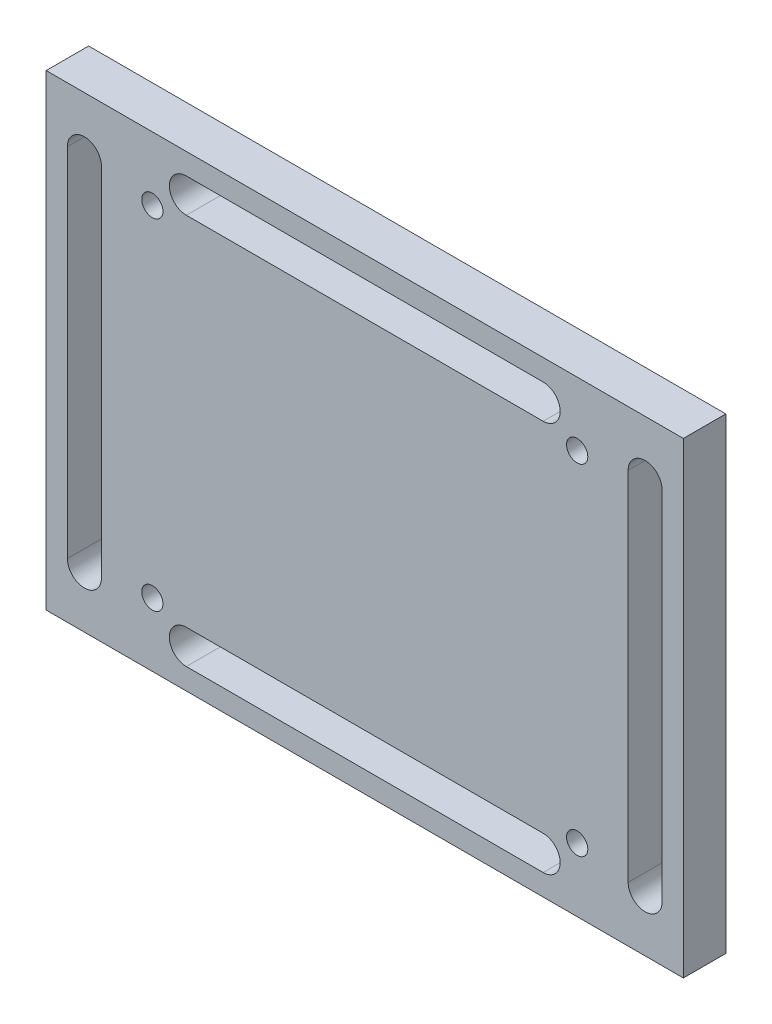
ISO-10303-21;
HEADER;
FILE_DESCRIPTION(('STEP AP214'),'2;1');
FILE_NAME('part.step','',(''),(''),'','','');
FILE_SCHEMA(('AUTOMOTIVE_DESIGN { 1 0 10303 214 1 1 1 1 }'));
ENDSEC;
DATA;
#1=APPLICATION_CONTEXT('core data for automotive mechanical design processes');
#2=APPLICATION_PROTOCOL_DEFINITION('international standard','automotive_design',2000,#1);
#3=PRODUCT_CONTEXT('',#1,'mechanical');
#4=PRODUCT('Part','Part','',(#3));
#5=PRODUCT_RELATED_PRODUCT_CATEGORY('part','',(#4));
#6=PRODUCT_DEFINITION_FORMATION('','',#4);
#7=PRODUCT_DEFINITION_CONTEXT('part definition',#1,'design');
#8=PRODUCT_DEFINITION('design','',#6,#7);
#9=PRODUCT_DEFINITION_SHAPE('','',#8);
#10=(LENGTH_UNIT() NAMED_UNIT(*) SI_UNIT(.MILLI.,.METRE.));
#11=(NAMED_UNIT(*) PLANE_ANGLE_UNIT() SI_UNIT($,.RADIAN.));
#12=(NAMED_UNIT(*) SI_UNIT($,.STERADIAN.) SOLID_ANGLE_UNIT());
#13=UNCERTAINTY_MEASURE_WITH_UNIT(LENGTH_MEASURE(1.E-05),#10,'distance_accuracy_value','');
#14=(GEOMETRIC_REPRESENTATION_CONTEXT(3) GLOBAL_UNCERTAINTY_ASSIGNED_CONTEXT((#13)) GLOBAL_UNIT_ASSIGNED_CONTEXT((#10,
#11,#12)) REPRESENTATION_CONTEXT('',''));
#15=CARTESIAN_POINT('',(0.,0.,0.));
#16=DIRECTION('',(0.,0.,1.));
#17=DIRECTION('',(1.,0.,0.));
#18=AXIS2_PLACEMENT_3D('',#15,#16,#17);
#19=CARTESIAN_POINT('',(0.,0.,5.));
#20=DIRECTION('',(0.,0.,1.));
#21=DIRECTION('',(1.,0.,0.));
#22=AXIS2_PLACEMENT_3D('',#19,#20,#21);
#23=PLANE('',#22);
#24=CARTESIAN_POINT('',(25.,-20.,5.));
#25=DIRECTION('',(0.,0.,1.));
#26=DIRECTION('',(1.,0.,0.));
#27=AXIS2_PLACEMENT_3D('',#24,#25,#26);
#28=CIRCLE('',#27,1.25);
#29=CARTESIAN_POINT('',(26.25,-20.,5.));
#30=VERTEX_POINT('',#29);
#31=EDGE_CURVE('E304',#30,#30,#28,.T.);
#32=ORIENTED_EDGE('',*,*,#31,.F.);
#33=EDGE_LOOP('',(#32));
#34=FACE_BOUND('',#33,.T.);
#35=CARTESIAN_POINT('',(-25.,20.,5.));
#36=DIRECTION('',(0.,0.,1.));
#37=DIRECTION('',(1.,0.,0.));
#38=AXIS2_PLACEMENT_3D('',#35,#36,#37);
#39=CIRCLE('',#38,1.25);
#40=CARTESIAN_POINT('',(-23.75,20.,5.));
#41=VERTEX_POINT('',#40);
#42=EDGE_CURVE('E316',#41,#41,#39,.T.);
#43=ORIENTED_EDGE('',*,*,#42,.F.);
#44=EDGE_LOOP('',(#43));
#45=FACE_BOUND('',#44,.T.);
#46=DIRECTION('',(-1.,0.,0.));
#47=VECTOR('',#46,1.);
#48=CARTESIAN_POINT('',(37.5,27.5,5.));
#49=LINE('',#48,#47);
#50=CARTESIAN_POINT('',(37.5,27.5,5.));
#51=VERTEX_POINT('',#50);
#52=CARTESIAN_POINT('',(-37.5,27.5,5.));
#53=VERTEX_POINT('',#52);
#54=EDGE_CURVE('E322',#51,#53,#49,.T.);
#55=ORIENTED_EDGE('',*,*,#54,.T.);
#56=DIRECTION('',(0.,-1.,0.));
#57=VECTOR('',#56,1.);
#58=CARTESIAN_POINT('',(-37.5,27.5,5.));
#59=LINE('',#58,#57);
#60=CARTESIAN_POINT('',(-37.5,-27.5,5.));
#61=VERTEX_POINT('',#60);
#62=EDGE_CURVE('E325',#53,#61,#59,.T.);
#63=ORIENTED_EDGE('',*,*,#62,.T.);
#64=DIRECTION('',(1.,0.,0.));
#65=VECTOR('',#64,1.);
#66=CARTESIAN_POINT('',(-37.5,-27.5,5.));
#67=LINE('',#66,#65);
#68=CARTESIAN_POINT('',(37.5,-27.5,5.));
#69=VERTEX_POINT('',#68);
#70=EDGE_CURVE('E328',#61,#69,#67,.T.);
#71=ORIENTED_EDGE('',*,*,#70,.T.);
#72=DIRECTION('',(0.,1.,0.));
#73=VECTOR('',#72,1.);
#74=CARTESIAN_POINT('',(37.5,-27.5,5.));
#75=LINE('',#74,#73);
#76=EDGE_CURVE('E330',#69,#51,#75,.T.);
#77=ORIENTED_EDGE('',*,*,#76,.T.);
#78=EDGE_LOOP('',(#55,#63,#71,#77));
#79=FACE_BOUND('',#78,.T.);
#80=CARTESIAN_POINT('',(25.,20.,5.));
#81=DIRECTION('',(0.,0.,1.));
#82=DIRECTION('',(1.,0.,0.));
#83=AXIS2_PLACEMENT_3D('',#80,#81,#82);
#84=CIRCLE('',#83,1.25);
#85=CARTESIAN_POINT('',(26.25,20.,5.));
#86=VERTEX_POINT('',#85);
#87=EDGE_CURVE('E310',#86,#86,#84,.T.);
#88=ORIENTED_EDGE('',*,*,#87,.F.);
#89=EDGE_LOOP('',(#88));
#90=FACE_BOUND('',#89,.T.);
#91=CARTESIAN_POINT('',(-25.,-20.,5.));
#92=DIRECTION('',(0.,0.,1.));
#93=DIRECTION('',(1.,0.,0.));
#94=AXIS2_PLACEMENT_3D('',#91,#92,#93);
#95=CIRCLE('',#94,1.25);
#96=CARTESIAN_POINT('',(-23.75,-20.,5.));
#97=VERTEX_POINT('',#96);
#98=EDGE_CURVE('E298',#97,#97,#95,.T.);
#99=ORIENTED_EDGE('',*,*,#98,.F.);
#100=EDGE_LOOP('',(#99));
#101=FACE_BOUND('',#100,.T.);
#102=DIRECTION('',(1.,0.,0.));
#103=VECTOR('',#102,1.);
#104=CARTESIAN_POINT('',(-21.,21.,5.));
#105=LINE('',#104,#103);
#106=CARTESIAN_POINT('',(-21.,21.,5.));
#107=VERTEX_POINT('',#106);
#108=CARTESIAN_POINT('',(21.,21.,5.));
#109=VERTEX_POINT('',#108);
#110=EDGE_CURVE('E269',#107,#109,#105,.T.);
#111=ORIENTED_EDGE('',*,*,#110,.F.);
#112=CARTESIAN_POINT('',(-21.,23.,5.));
#113=DIRECTION('',(0.,0.,1.));
#114=DIRECTION('',(1.,0.,0.));
#115=AXIS2_PLACEMENT_3D('',#112,#113,#114);
#116=CIRCLE('',#115,2.);
#117=CARTESIAN_POINT('',(-21.,25.,5.));
#118=VERTEX_POINT('',#117);
#119=EDGE_CURVE('E267',#118,#107,#116,.T.);
#120=ORIENTED_EDGE('',*,*,#119,.F.);
#121=DIRECTION('',(-1.,0.,0.));
#122=VECTOR('',#121,1.);
#123=CARTESIAN_POINT('',(-21.,25.,5.));
#124=LINE('',#123,#122);
#125=CARTESIAN_POINT('',(21.,25.,5.));
#126=VERTEX_POINT('',#125);
#127=EDGE_CURVE('E275',#126,#118,#124,.T.);
#128=ORIENTED_EDGE('',*,*,#127,.F.);
#129=CARTESIAN_POINT('',(21.,23.,5.));
#130=DIRECTION('',(0.,0.,1.));
#131=DIRECTION('',(1.,0.,0.));
#132=AXIS2_PLACEMENT_3D('',#129,#130,#131);
#133=CIRCLE('',#132,2.);
#134=EDGE_CURVE('E272',#109,#126,#133,.T.);
#135=ORIENTED_EDGE('',*,*,#134,.F.);
#136=EDGE_LOOP('',(#111,#120,#128,#135));
#137=FACE_BOUND('',#136,.T.);
#138=DIRECTION('',(1.,0.,0.));
#139=VECTOR('',#138,1.);
#140=CARTESIAN_POINT('',(-21.,-25.,5.));
#141=LINE('',#140,#139);
#142=CARTESIAN_POINT('',(-21.,-25.,5.));
#143=VERTEX_POINT('',#142);
#144=CARTESIAN_POINT('',(21.,-25.,5.));
#145=VERTEX_POINT('',#144);
#146=EDGE_CURVE('E238',#143,#145,#141,.T.);
#147=ORIENTED_EDGE('',*,*,#146,.F.);
#148=CARTESIAN_POINT('',(-21.,-23.,5.));
#149=DIRECTION('',(0.,0.,1.));
#150=DIRECTION('',(-1.,0.,0.));
#151=AXIS2_PLACEMENT_3D('',#148,#149,#150);
#152=CIRCLE('',#151,2.);
#153=CARTESIAN_POINT('',(-21.,-21.,5.));
#154=VERTEX_POINT('',#153);
#155=EDGE_CURVE('E236',#154,#143,#152,.T.);
#156=ORIENTED_EDGE('',*,*,#155,.F.);
#157=DIRECTION('',(-1.,0.,0.));
#158=VECTOR('',#157,1.);
#159=CARTESIAN_POINT('',(-21.,-21.,5.));
#160=LINE('',#159,#158);
#161=CARTESIAN_POINT('',(21.,-21.,5.));
#162=VERTEX_POINT('',#161);
#163=EDGE_CURVE('E244',#162,#154,#160,.T.);
#164=ORIENTED_EDGE('',*,*,#163,.F.);
#165=CARTESIAN_POINT('',(21.,-23.,5.));
#166=DIRECTION('',(0.,0.,1.));
#167=DIRECTION('',(-1.,0.,0.));
#168=AXIS2_PLACEMENT_3D('',#165,#166,#167);
#169=CIRCLE('',#168,2.);
#170=EDGE_CURVE('E241',#145,#162,#169,.T.);
#171=ORIENTED_EDGE('',*,*,#170,.F.);
#172=EDGE_LOOP('',(#147,#156,#164,#171));
#173=FACE_BOUND('',#172,.T.);
#174=DIRECTION('',(0.,-1.,0.));
#175=VECTOR('',#174,1.);
#176=CARTESIAN_POINT('',(-35.,21.,5.));
#177=LINE('',#176,#175);
#178=CARTESIAN_POINT('',(-35.,21.,5.));
#179=VERTEX_POINT('',#178);
#180=CARTESIAN_POINT('',(-35.,-21.,5.));
#181=VERTEX_POINT('',#180);
#182=EDGE_CURVE('E207',#179,#181,#177,.T.);
#183=ORIENTED_EDGE('',*,*,#182,.F.);
#184=CARTESIAN_POINT('',(-33.,21.,5.));
#185=DIRECTION('',(0.,0.,1.));
#186=DIRECTION('',(1.,0.,0.));
#187=AXIS2_PLACEMENT_3D('',#184,#185,#186);
#188=CIRCLE('',#187,2.00000000000001);
#189=CARTESIAN_POINT('',(-31.,21.,5.));
#190=VERTEX_POINT('',#189);
#191=EDGE_CURVE('E205',#190,#179,#188,.T.);
#192=ORIENTED_EDGE('',*,*,#191,.F.);
#193=DIRECTION('',(0.,1.,0.));
#194=VECTOR('',#193,1.);
#195=CARTESIAN_POINT('',(-31.,21.,5.));
#196=LINE('',#195,#194);
#197=CARTESIAN_POINT('',(-31.,-21.,5.));
#198=VERTEX_POINT('',#197);
#199=EDGE_CURVE('E213',#198,#190,#196,.T.);
#200=ORIENTED_EDGE('',*,*,#199,.F.);
#201=CARTESIAN_POINT('',(-33.,-21.,5.));
#202=DIRECTION('',(0.,0.,1.));
#203=DIRECTION('',(1.,0.,0.));
#204=AXIS2_PLACEMENT_3D('',#201,#202,#203);
#205=CIRCLE('',#204,2.00000000000001);
#206=EDGE_CURVE('E210',#181,#198,#205,.T.);
#207=ORIENTED_EDGE('',*,*,#206,.F.);
#208=EDGE_LOOP('',(#183,#192,#200,#207));
#209=FACE_BOUND('',#208,.T.);
#210=DIRECTION('',(0.,-1.,0.));
#211=VECTOR('',#210,1.);
#212=CARTESIAN_POINT('',(30.9999999999998,21.,5.));
#213=LINE('',#212,#211);
#214=CARTESIAN_POINT('',(30.9999999999998,21.,5.));
#215=VERTEX_POINT('',#214);
#216=CARTESIAN_POINT('',(31.0000000000001,-20.9999999999998,5.));
#217=VERTEX_POINT('',#216);
#218=EDGE_CURVE('E177',#215,#217,#213,.T.);
#219=ORIENTED_EDGE('',*,*,#218,.F.);
#220=CARTESIAN_POINT('',(32.9999999999998,21.0000000000004,5.));
#221=DIRECTION('',(0.,0.,1.));
#222=DIRECTION('',(-1.,0.,0.));
#223=AXIS2_PLACEMENT_3D('',#220,#221,#222);
#224=CIRCLE('',#223,2.00000000000001);
#225=CARTESIAN_POINT('',(34.9999999999999,21.0000000000004,5.));
#226=VERTEX_POINT('',#225);
#227=EDGE_CURVE('E169',#226,#215,#224,.T.);
#228=ORIENTED_EDGE('',*,*,#227,.F.);
#229=DIRECTION('',(0.,1.,0.));
#230=VECTOR('',#229,1.);
#231=CARTESIAN_POINT('',(34.9999999999999,21.0000000000004,5.));
#232=LINE('',#231,#230);
#233=CARTESIAN_POINT('',(35.0000000000001,-20.9999999999998,5.));
#234=VERTEX_POINT('',#233);
#235=EDGE_CURVE('E191',#234,#226,#232,.T.);
#236=ORIENTED_EDGE('',*,*,#235,.F.);
#237=CARTESIAN_POINT('',(33.0000000000001,-20.9999999999998,5.));
#238=DIRECTION('',(0.,0.,1.));
#239=DIRECTION('',(-1.,0.,0.));
#240=AXIS2_PLACEMENT_3D('',#237,#238,#239);
#241=CIRCLE('',#240,2.00000000000001);
#242=EDGE_CURVE('E189',#217,#234,#241,.T.);
#243=ORIENTED_EDGE('',*,*,#242,.F.);
#244=EDGE_LOOP('',(#219,#228,#236,#243));
#245=FACE_BOUND('',#244,.T.);
#246=ADVANCED_FACE('F32',(#34,#45,#79,#90,#101,#137,#173,#209,#245),#23,.T.);
#247=CARTESIAN_POINT('',(0.,0.,0.));
#248=DIRECTION('',(0.,0.,1.));
#249=DIRECTION('',(1.,0.,0.));
#250=AXIS2_PLACEMENT_3D('',#247,#248,#249);
#251=PLANE('',#250);
#252=CARTESIAN_POINT('',(-33.,21.,0.));
#253=DIRECTION('',(0.,0.,1.));
#254=DIRECTION('',(1.,0.,0.));
#255=AXIS2_PLACEMENT_3D('',#252,#253,#254);
#256=CIRCLE('',#255,2.00000000000001);
#257=CARTESIAN_POINT('',(-31.,21.,0.));
#258=VERTEX_POINT('',#257);
#259=CARTESIAN_POINT('',(-35.,21.,0.));
#260=VERTEX_POINT('',#259);
#261=EDGE_CURVE('E185',#258,#260,#256,.T.);
#262=ORIENTED_EDGE('',*,*,#261,.T.);
#263=DIRECTION('',(0.,-1.,0.));
#264=VECTOR('',#263,1.);
#265=CARTESIAN_POINT('',(-35.,21.,0.));
#266=LINE('',#265,#264);
#267=CARTESIAN_POINT('',(-35.,-21.,0.));
#268=VERTEX_POINT('',#267);
#269=EDGE_CURVE('E218',#260,#268,#266,.T.);
#270=ORIENTED_EDGE('',*,*,#269,.T.);
#271=CARTESIAN_POINT('',(-33.,-21.,0.));
#272=DIRECTION('',(0.,0.,1.));
#273=DIRECTION('',(1.,0.,0.));
#274=AXIS2_PLACEMENT_3D('',#271,#272,#273);
#275=CIRCLE('',#274,2.00000000000001);
#276=CARTESIAN_POINT('',(-31.,-21.,0.));
#277=VERTEX_POINT('',#276);
#278=EDGE_CURVE('E221',#268,#277,#275,.T.);
#279=ORIENTED_EDGE('',*,*,#278,.T.);
#280=DIRECTION('',(0.,1.,0.));
#281=VECTOR('',#280,1.);
#282=CARTESIAN_POINT('',(-31.,21.,0.));
#283=LINE('',#282,#281);
#284=EDGE_CURVE('E208',#277,#258,#283,.T.);
#285=ORIENTED_EDGE('',*,*,#284,.T.);
#286=EDGE_LOOP('',(#262,#270,#279,#285));
#287=FACE_BOUND('',#286,.T.);
#288=CARTESIAN_POINT('',(-21.,23.,0.));
#289=DIRECTION('',(0.,0.,1.));
#290=DIRECTION('',(1.,0.,0.));
#291=AXIS2_PLACEMENT_3D('',#288,#289,#290);
#292=CIRCLE('',#291,2.);
#293=CARTESIAN_POINT('',(-21.,25.,0.));
#294=VERTEX_POINT('',#293);
#295=CARTESIAN_POINT('',(-21.,21.,0.));
#296=VERTEX_POINT('',#295);
#297=EDGE_CURVE('E266',#294,#296,#292,.T.);
#298=ORIENTED_EDGE('',*,*,#297,.T.);
#299=DIRECTION('',(1.,0.,0.));
#300=VECTOR('',#299,1.);
#301=CARTESIAN_POINT('',(-21.,21.,0.));
#302=LINE('',#301,#300);
#303=CARTESIAN_POINT('',(21.,21.,0.));
#304=VERTEX_POINT('',#303);
#305=EDGE_CURVE('E280',#296,#304,#302,.T.);
#306=ORIENTED_EDGE('',*,*,#305,.T.);
#307=CARTESIAN_POINT('',(21.,23.,0.));
#308=DIRECTION('',(0.,0.,1.));
#309=DIRECTION('',(1.,0.,0.));
#310=AXIS2_PLACEMENT_3D('',#307,#308,#309);
#311=CIRCLE('',#310,2.);
#312=CARTESIAN_POINT('',(21.,25.,0.));
#313=VERTEX_POINT('',#312);
#314=EDGE_CURVE('E283',#304,#313,#311,.T.);
#315=ORIENTED_EDGE('',*,*,#314,.T.);
#316=DIRECTION('',(-1.,0.,0.));
#317=VECTOR('',#316,1.);
#318=CARTESIAN_POINT('',(-21.,25.,0.));
#319=LINE('',#318,#317);
#320=EDGE_CURVE('E270',#313,#294,#319,.T.);
#321=ORIENTED_EDGE('',*,*,#320,.T.);
#322=EDGE_LOOP('',(#298,#306,#315,#321));
#323=FACE_BOUND('',#322,.T.);
#324=DIRECTION('',(-1.,0.,0.));
#325=VECTOR('',#324,1.);
#326=CARTESIAN_POINT('',(37.5,27.5,0.));
#327=LINE('',#326,#325);
#328=CARTESIAN_POINT('',(37.5,27.5,0.));
#329=VERTEX_POINT('',#328);
#330=CARTESIAN_POINT('',(-37.5,27.5,0.));
#331=VERTEX_POINT('',#330);
#332=EDGE_CURVE('E319',#329,#331,#327,.T.);
#333=ORIENTED_EDGE('',*,*,#332,.F.);
#334=DIRECTION('',(0.,1.,0.));
#335=VECTOR('',#334,1.);
#336=CARTESIAN_POINT('',(37.5,-27.5,0.));
#337=LINE('',#336,#335);
#338=CARTESIAN_POINT('',(37.5,-27.5,0.));
#339=VERTEX_POINT('',#338);
#340=EDGE_CURVE('E326',#339,#329,#337,.T.);
#341=ORIENTED_EDGE('',*,*,#340,.F.);
#342=DIRECTION('',(1.,0.,0.));
#343=VECTOR('',#342,1.);
#344=CARTESIAN_POINT('',(-37.5,-27.5,0.));
#345=LINE('',#344,#343);
#346=CARTESIAN_POINT('',(-37.5,-27.5,0.));
#347=VERTEX_POINT('',#346);
#348=EDGE_CURVE('E337',#347,#339,#345,.T.);
#349=ORIENTED_EDGE('',*,*,#348,.F.);
#350=DIRECTION('',(0.,-1.,0.));
#351=VECTOR('',#350,1.);
#352=CARTESIAN_POINT('',(-37.5,27.5,0.));
#353=LINE('',#352,#351);
#354=EDGE_CURVE('E335',#331,#347,#353,.T.);
#355=ORIENTED_EDGE('',*,*,#354,.F.);
#356=EDGE_LOOP('',(#333,#341,#349,#355));
#357=FACE_BOUND('',#356,.T.);
#358=CARTESIAN_POINT('',(-25.,20.,0.));
#359=DIRECTION('',(0.,0.,1.));
#360=DIRECTION('',(1.,0.,0.));
#361=AXIS2_PLACEMENT_3D('',#358,#359,#360);
#362=CIRCLE('',#361,1.25);
#363=CARTESIAN_POINT('',(-23.75,20.,0.));
#364=VERTEX_POINT('',#363);
#365=EDGE_CURVE('E313',#364,#364,#362,.T.);
#366=ORIENTED_EDGE('',*,*,#365,.T.);
#367=EDGE_LOOP('',(#366));
#368=FACE_BOUND('',#367,.T.);
#369=CARTESIAN_POINT('',(25.,20.,0.));
#370=DIRECTION('',(0.,0.,1.));
#371=DIRECTION('',(1.,0.,0.));
#372=AXIS2_PLACEMENT_3D('',#369,#370,#371);
#373=CIRCLE('',#372,1.25);
#374=CARTESIAN_POINT('',(26.25,20.,0.));
#375=VERTEX_POINT('',#374);
#376=EDGE_CURVE('E307',#375,#375,#373,.T.);
#377=ORIENTED_EDGE('',*,*,#376,.T.);
#378=EDGE_LOOP('',(#377));
#379=FACE_BOUND('',#378,.T.);
#380=CARTESIAN_POINT('',(25.,-20.,0.));
#381=DIRECTION('',(0.,0.,1.));
#382=DIRECTION('',(1.,0.,0.));
#383=AXIS2_PLACEMENT_3D('',#380,#381,#382);
#384=CIRCLE('',#383,1.25);
#385=CARTESIAN_POINT('',(26.25,-20.,0.));
#386=VERTEX_POINT('',#385);
#387=EDGE_CURVE('E301',#386,#386,#384,.T.);
#388=ORIENTED_EDGE('',*,*,#387,.T.);
#389=EDGE_LOOP('',(#388));
#390=FACE_BOUND('',#389,.T.);
#391=CARTESIAN_POINT('',(-25.,-20.,0.));
#392=DIRECTION('',(0.,0.,1.));
#393=DIRECTION('',(1.,0.,0.));
#394=AXIS2_PLACEMENT_3D('',#391,#392,#393);
#395=CIRCLE('',#394,1.25);
#396=CARTESIAN_POINT('',(-23.75,-20.,0.));
#397=VERTEX_POINT('',#396);
#398=EDGE_CURVE('E297',#397,#397,#395,.T.);
#399=ORIENTED_EDGE('',*,*,#398,.T.);
#400=EDGE_LOOP('',(#399));
#401=FACE_BOUND('',#400,.T.);
#402=CARTESIAN_POINT('',(-21.,-23.,0.));
#403=DIRECTION('',(0.,0.,1.));
#404=DIRECTION('',(-1.,0.,0.));
#405=AXIS2_PLACEMENT_3D('',#402,#403,#404);
#406=CIRCLE('',#405,2.);
#407=CARTESIAN_POINT('',(-21.,-21.,0.));
#408=VERTEX_POINT('',#407);
#409=CARTESIAN_POINT('',(-21.,-25.,0.));
#410=VERTEX_POINT('',#409);
#411=EDGE_CURVE('E235',#408,#410,#406,.T.);
#412=ORIENTED_EDGE('',*,*,#411,.T.);
#413=DIRECTION('',(1.,0.,0.));
#414=VECTOR('',#413,1.);
#415=CARTESIAN_POINT('',(-21.,-25.,0.));
#416=LINE('',#415,#414);
#417=CARTESIAN_POINT('',(21.,-25.,0.));
#418=VERTEX_POINT('',#417);
#419=EDGE_CURVE('E249',#410,#418,#416,.T.);
#420=ORIENTED_EDGE('',*,*,#419,.T.);
#421=CARTESIAN_POINT('',(21.,-23.,0.));
#422=DIRECTION('',(0.,0.,1.));
#423=DIRECTION('',(-1.,0.,0.));
#424=AXIS2_PLACEMENT_3D('',#421,#422,#423);
#425=CIRCLE('',#424,2.);
#426=CARTESIAN_POINT('',(21.,-21.,0.));
#427=VERTEX_POINT('',#426);
#428=EDGE_CURVE('E252',#418,#427,#425,.T.);
#429=ORIENTED_EDGE('',*,*,#428,.T.);
#430=DIRECTION('',(-1.,0.,0.));
#431=VECTOR('',#430,1.);
#432=CARTESIAN_POINT('',(-21.,-21.,0.));
#433=LINE('',#432,#431);
#434=EDGE_CURVE('E239',#427,#408,#433,.T.);
#435=ORIENTED_EDGE('',*,*,#434,.T.);
#436=EDGE_LOOP('',(#412,#420,#429,#435));
#437=FACE_BOUND('',#436,.T.);
#438=CARTESIAN_POINT('',(32.9999999999998,21.0000000000004,0.));
#439=DIRECTION('',(0.,0.,1.));
#440=DIRECTION('',(-1.,0.,0.));
#441=AXIS2_PLACEMENT_3D('',#438,#439,#440);
#442=CIRCLE('',#441,2.00000000000001);
#443=CARTESIAN_POINT('',(34.9999999999999,21.0000000000004,0.));
#444=VERTEX_POINT('',#443);
#445=CARTESIAN_POINT('',(30.9999999999998,21.,0.));
#446=VERTEX_POINT('',#445);
#447=EDGE_CURVE('E55',#444,#446,#442,.T.);
#448=ORIENTED_EDGE('',*,*,#447,.T.);
#449=DIRECTION('',(0.,-1.,0.));
#450=VECTOR('',#449,1.);
#451=CARTESIAN_POINT('',(30.9999999999998,21.,0.));
#452=LINE('',#451,#450);
#453=CARTESIAN_POINT('',(31.0000000000001,-20.9999999999998,0.));
#454=VERTEX_POINT('',#453);
#455=EDGE_CURVE('E184',#446,#454,#452,.T.);
#456=ORIENTED_EDGE('',*,*,#455,.T.);
#457=CARTESIAN_POINT('',(33.0000000000001,-20.9999999999998,0.));
#458=DIRECTION('',(0.,0.,1.));
#459=DIRECTION('',(-1.,0.,0.));
#460=AXIS2_PLACEMENT_3D('',#457,#458,#459);
#461=CIRCLE('',#460,2.00000000000001);
#462=CARTESIAN_POINT('',(35.0000000000001,-20.9999999999998,0.));
#463=VERTEX_POINT('',#462);
#464=EDGE_CURVE('E197',#454,#463,#461,.T.);
#465=ORIENTED_EDGE('',*,*,#464,.T.);
#466=DIRECTION('',(0.,1.,0.));
#467=VECTOR('',#466,1.);
#468=CARTESIAN_POINT('',(34.9999999999999,21.0000000000004,0.));
#469=LINE('',#468,#467);
#470=EDGE_CURVE('E178',#463,#444,#469,.T.);
#471=ORIENTED_EDGE('',*,*,#470,.T.);
#472=EDGE_LOOP('',(#448,#456,#465,#471));
#473=FACE_BOUND('',#472,.T.);
#474=ADVANCED_FACE('F355',(#287,#323,#357,#368,#379,#390,#401,#437,#473),#251,.F.);
#475=CARTESIAN_POINT('',(37.5,27.5,5.));
#476=DIRECTION('',(0.,-1.,0.));
#477=DIRECTION('',(1.,0.,0.));
#478=AXIS2_PLACEMENT_3D('',#475,#476,#477);
#479=PLANE('',#478);
#480=ORIENTED_EDGE('',*,*,#332,.T.);
#481=DIRECTION('',(0.,0.,-1.));
#482=VECTOR('',#481,1.);
#483=CARTESIAN_POINT('',(-37.5,27.5,5.));
#484=LINE('',#483,#482);
#485=EDGE_CURVE('E11',#53,#331,#484,.T.);
#486=ORIENTED_EDGE('',*,*,#485,.F.);
#487=ORIENTED_EDGE('',*,*,#54,.F.);
#488=DIRECTION('',(0.,0.,-1.));
#489=VECTOR('',#488,1.);
#490=CARTESIAN_POINT('',(37.5,27.5,5.));
#491=LINE('',#490,#489);
#492=EDGE_CURVE('E332',#51,#329,#491,.T.);
#493=ORIENTED_EDGE('',*,*,#492,.T.);
#494=EDGE_LOOP('',(#480,#486,#487,#493));
#495=FACE_BOUND('',#494,.T.);
#496=ADVANCED_FACE('F34',(#495),#479,.F.);
#497=CARTESIAN_POINT('',(-37.5,27.5,5.));
#498=DIRECTION('',(1.,0.,0.));
#499=DIRECTION('',(0.,0.,-1.));
#500=AXIS2_PLACEMENT_3D('',#497,#498,#499);
#501=PLANE('',#500);
#502=ORIENTED_EDGE('',*,*,#354,.T.);
#503=DIRECTION('',(0.,0.,-1.));
#504=VECTOR('',#503,1.);
#505=CARTESIAN_POINT('',(-37.5,-27.5,5.));
#506=LINE('',#505,#504);
#507=EDGE_CURVE('E40',#61,#347,#506,.T.);
#508=ORIENTED_EDGE('',*,*,#507,.F.);
#509=ORIENTED_EDGE('',*,*,#62,.F.);
#510=ORIENTED_EDGE('',*,*,#485,.T.);
#511=EDGE_LOOP('',(#502,#508,#509,#510));
#512=FACE_BOUND('',#511,.T.);
#513=ADVANCED_FACE('F366',(#512),#501,.F.);
#514=CARTESIAN_POINT('',(-37.5,-27.5,5.));
#515=DIRECTION('',(0.,1.,0.));
#516=DIRECTION('',(-1.,0.,0.));
#517=AXIS2_PLACEMENT_3D('',#514,#515,#516);
#518=PLANE('',#517);
#519=ORIENTED_EDGE('',*,*,#348,.T.);
#520=DIRECTION('',(0.,0.,-1.));
#521=VECTOR('',#520,1.);
#522=CARTESIAN_POINT('',(37.5,-27.5,5.));
#523=LINE('',#522,#521);
#524=EDGE_CURVE('E342',#69,#339,#523,.T.);
#525=ORIENTED_EDGE('',*,*,#524,.F.);
#526=ORIENTED_EDGE('',*,*,#70,.F.);
#527=ORIENTED_EDGE('',*,*,#507,.T.);
#528=EDGE_LOOP('',(#519,#525,#526,#527));
#529=FACE_BOUND('',#528,.T.);
#530=ADVANCED_FACE('F349',(#529),#518,.F.);
#531=CARTESIAN_POINT('',(37.5,-27.5,5.));
#532=DIRECTION('',(-1.,0.,0.));
#533=DIRECTION('',(0.,0.,1.));
#534=AXIS2_PLACEMENT_3D('',#531,#532,#533);
#535=PLANE('',#534);
#536=ORIENTED_EDGE('',*,*,#340,.T.);
#537=ORIENTED_EDGE('',*,*,#492,.F.);
#538=ORIENTED_EDGE('',*,*,#76,.F.);
#539=ORIENTED_EDGE('',*,*,#524,.T.);
#540=EDGE_LOOP('',(#536,#537,#538,#539));
#541=FACE_BOUND('',#540,.T.);
#542=ADVANCED_FACE('F359',(#541),#535,.F.);
#543=CARTESIAN_POINT('',(-25.,20.,5.));
#544=DIRECTION('',(0.,0.,-1.));
#545=DIRECTION('',(-1.,0.,0.));
#546=AXIS2_PLACEMENT_3D('',#543,#544,#545);
#547=CYLINDRICAL_SURFACE('',#546,1.25);
#548=ORIENTED_EDGE('',*,*,#42,.T.);
#549=EDGE_LOOP('',(#548));
#550=FACE_BOUND('',#549,.T.);
#551=ORIENTED_EDGE('',*,*,#365,.F.);
#552=EDGE_LOOP('',(#551));
#553=FACE_BOUND('',#552,.T.);
#554=ADVANCED_FACE('F384',(#550,#553),#547,.F.);
#555=CARTESIAN_POINT('',(25.,20.,5.));
#556=DIRECTION('',(0.,0.,-1.));
#557=DIRECTION('',(-1.,0.,0.));
#558=AXIS2_PLACEMENT_3D('',#555,#556,#557);
#559=CYLINDRICAL_SURFACE('',#558,1.25);
#560=ORIENTED_EDGE('',*,*,#87,.T.);
#561=EDGE_LOOP('',(#560));
#562=FACE_BOUND('',#561,.T.);
#563=ORIENTED_EDGE('',*,*,#376,.F.);
#564=EDGE_LOOP('',(#563));
#565=FACE_BOUND('',#564,.T.);
#566=ADVANCED_FACE('F391',(#562,#565),#559,.F.);
#567=CARTESIAN_POINT('',(25.,-20.,5.));
#568=DIRECTION('',(0.,0.,-1.));
#569=DIRECTION('',(-1.,0.,0.));
#570=AXIS2_PLACEMENT_3D('',#567,#568,#569);
#571=CYLINDRICAL_SURFACE('',#570,1.25);
#572=ORIENTED_EDGE('',*,*,#31,.T.);
#573=EDGE_LOOP('',(#572));
#574=FACE_BOUND('',#573,.T.);
#575=ORIENTED_EDGE('',*,*,#387,.F.);
#576=EDGE_LOOP('',(#575));
#577=FACE_BOUND('',#576,.T.);
#578=ADVANCED_FACE('F396',(#574,#577),#571,.F.);
#579=CARTESIAN_POINT('',(-25.,-20.,5.));
#580=DIRECTION('',(0.,0.,-1.));
#581=DIRECTION('',(-1.,0.,0.));
#582=AXIS2_PLACEMENT_3D('',#579,#580,#581);
#583=CYLINDRICAL_SURFACE('',#582,1.25);
#584=ORIENTED_EDGE('',*,*,#98,.T.);
#585=EDGE_LOOP('',(#584));
#586=FACE_BOUND('',#585,.T.);
#587=ORIENTED_EDGE('',*,*,#398,.F.);
#588=EDGE_LOOP('',(#587));
#589=FACE_BOUND('',#588,.T.);
#590=ADVANCED_FACE('F471',(#586,#589),#583,.F.);
#591=CARTESIAN_POINT('',(-21.,23.,5.));
#592=DIRECTION('',(0.,0.,-1.));
#593=DIRECTION('',(-1.,0.,0.));
#594=AXIS2_PLACEMENT_3D('',#591,#592,#593);
#595=CYLINDRICAL_SURFACE('',#594,2.);
#596=ORIENTED_EDGE('',*,*,#297,.F.);
#597=DIRECTION('',(0.,0.,-1.));
#598=VECTOR('',#597,1.);
#599=CARTESIAN_POINT('',(-21.,25.,5.));
#600=LINE('',#599,#598);
#601=EDGE_CURVE('E277',#118,#294,#600,.T.);
#602=ORIENTED_EDGE('',*,*,#601,.F.);
#603=ORIENTED_EDGE('',*,*,#119,.T.);
#604=DIRECTION('',(0.,0.,-1.));
#605=VECTOR('',#604,1.);
#606=CARTESIAN_POINT('',(-21.,21.,5.));
#607=LINE('',#606,#605);
#608=EDGE_CURVE('E294',#107,#296,#607,.T.);
#609=ORIENTED_EDGE('',*,*,#608,.T.);
#610=EDGE_LOOP('',(#596,#602,#603,#609));
#611=FACE_BOUND('',#610,.T.);
#612=ADVANCED_FACE('F467',(#611),#595,.F.);
#613=CARTESIAN_POINT('',(-21.,21.,5.));
#614=DIRECTION('',(0.,1.,0.));
#615=DIRECTION('',(-1.,0.,0.));
#616=AXIS2_PLACEMENT_3D('',#613,#614,#615);
#617=PLANE('',#616);
#618=ORIENTED_EDGE('',*,*,#305,.F.);
#619=ORIENTED_EDGE('',*,*,#608,.F.);
#620=ORIENTED_EDGE('',*,*,#110,.T.);
#621=DIRECTION('',(0.,0.,-1.));
#622=VECTOR('',#621,1.);
#623=CARTESIAN_POINT('',(21.,21.,5.));
#624=LINE('',#623,#622);
#625=EDGE_CURVE('E292',#109,#304,#624,.T.);
#626=ORIENTED_EDGE('',*,*,#625,.T.);
#627=EDGE_LOOP('',(#618,#619,#620,#626));
#628=FACE_BOUND('',#627,.T.);
#629=ADVANCED_FACE('F463',(#628),#617,.T.);
#630=CARTESIAN_POINT('',(21.,23.,5.));
#631=DIRECTION('',(0.,0.,-1.));
#632=DIRECTION('',(-1.,0.,0.));
#633=AXIS2_PLACEMENT_3D('',#630,#631,#632);
#634=CYLINDRICAL_SURFACE('',#633,2.);
#635=ORIENTED_EDGE('',*,*,#314,.F.);
#636=ORIENTED_EDGE('',*,*,#625,.F.);
#637=ORIENTED_EDGE('',*,*,#134,.T.);
#638=DIRECTION('',(0.,0.,-1.));
#639=VECTOR('',#638,1.);
#640=CARTESIAN_POINT('',(21.,25.,5.));
#641=LINE('',#640,#639);
#642=EDGE_CURVE('E290',#126,#313,#641,.T.);
#643=ORIENTED_EDGE('',*,*,#642,.T.);
#644=EDGE_LOOP('',(#635,#636,#637,#643));
#645=FACE_BOUND('',#644,.T.);
#646=ADVANCED_FACE('F459',(#645),#634,.F.);
#647=CARTESIAN_POINT('',(-21.,25.,5.));
#648=DIRECTION('',(0.,-1.,0.));
#649=DIRECTION('',(1.,0.,0.));
#650=AXIS2_PLACEMENT_3D('',#647,#648,#649);
#651=PLANE('',#650);
#652=ORIENTED_EDGE('',*,*,#320,.F.);
#653=ORIENTED_EDGE('',*,*,#642,.F.);
#654=ORIENTED_EDGE('',*,*,#127,.T.);
#655=ORIENTED_EDGE('',*,*,#601,.T.);
#656=EDGE_LOOP('',(#652,#653,#654,#655));
#657=FACE_BOUND('',#656,.T.);
#658=ADVANCED_FACE('F455',(#657),#651,.T.);
#659=CARTESIAN_POINT('',(-21.,-23.,5.));
#660=DIRECTION('',(0.,0.,-1.));
#661=DIRECTION('',(-1.,0.,0.));
#662=AXIS2_PLACEMENT_3D('',#659,#660,#661);
#663=CYLINDRICAL_SURFACE('',#662,2.);
#664=ORIENTED_EDGE('',*,*,#411,.F.);
#665=DIRECTION('',(0.,0.,-1.));
#666=VECTOR('',#665,1.);
#667=CARTESIAN_POINT('',(-21.,-21.,5.));
#668=LINE('',#667,#666);
#669=EDGE_CURVE('E246',#154,#408,#668,.T.);
#670=ORIENTED_EDGE('',*,*,#669,.F.);
#671=ORIENTED_EDGE('',*,*,#155,.T.);
#672=DIRECTION('',(0.,0.,-1.));
#673=VECTOR('',#672,1.);
#674=CARTESIAN_POINT('',(-21.,-25.,5.));
#675=LINE('',#674,#673);
#676=EDGE_CURVE('E263',#143,#410,#675,.T.);
#677=ORIENTED_EDGE('',*,*,#676,.T.);
#678=EDGE_LOOP('',(#664,#670,#671,#677));
#679=FACE_BOUND('',#678,.T.);
#680=ADVANCED_FACE('F451',(#679),#663,.F.);
#681=CARTESIAN_POINT('',(-21.,-25.,5.));
#682=DIRECTION('',(0.,1.,0.));
#683=DIRECTION('',(-1.,0.,0.));
#684=AXIS2_PLACEMENT_3D('',#681,#682,#683);
#685=PLANE('',#684);
#686=ORIENTED_EDGE('',*,*,#419,.F.);
#687=ORIENTED_EDGE('',*,*,#676,.F.);
#688=ORIENTED_EDGE('',*,*,#146,.T.);
#689=DIRECTION('',(0.,0.,-1.));
#690=VECTOR('',#689,1.);
#691=CARTESIAN_POINT('',(21.,-25.,5.));
#692=LINE('',#691,#690);
#693=EDGE_CURVE('E261',#145,#418,#692,.T.);
#694=ORIENTED_EDGE('',*,*,#693,.T.);
#695=EDGE_LOOP('',(#686,#687,#688,#694));
#696=FACE_BOUND('',#695,.T.);
#697=ADVANCED_FACE('F447',(#696),#685,.T.);
#698=CARTESIAN_POINT('',(21.,-23.,5.));
#699=DIRECTION('',(0.,0.,-1.));
#700=DIRECTION('',(-1.,0.,0.));
#701=AXIS2_PLACEMENT_3D('',#698,#699,#700);
#702=CYLINDRICAL_SURFACE('',#701,2.);
#703=ORIENTED_EDGE('',*,*,#428,.F.);
#704=ORIENTED_EDGE('',*,*,#693,.F.);
#705=ORIENTED_EDGE('',*,*,#170,.T.);
#706=DIRECTION('',(0.,0.,-1.));
#707=VECTOR('',#706,1.);
#708=CARTESIAN_POINT('',(21.,-21.,5.));
#709=LINE('',#708,#707);
#710=EDGE_CURVE('E259',#162,#427,#709,.T.);
#711=ORIENTED_EDGE('',*,*,#710,.T.);
#712=EDGE_LOOP('',(#703,#704,#705,#711));
#713=FACE_BOUND('',#712,.T.);
#714=ADVANCED_FACE('F443',(#713),#702,.F.);
#715=CARTESIAN_POINT('',(-21.,-21.,5.));
#716=DIRECTION('',(0.,-1.,0.));
#717=DIRECTION('',(1.,0.,0.));
#718=AXIS2_PLACEMENT_3D('',#715,#716,#717);
#719=PLANE('',#718);
#720=ORIENTED_EDGE('',*,*,#434,.F.);
#721=ORIENTED_EDGE('',*,*,#710,.F.);
#722=ORIENTED_EDGE('',*,*,#163,.T.);
#723=ORIENTED_EDGE('',*,*,#669,.T.);
#724=EDGE_LOOP('',(#720,#721,#722,#723));
#725=FACE_BOUND('',#724,.T.);
#726=ADVANCED_FACE('F439',(#725),#719,.T.);
#727=CARTESIAN_POINT('',(-33.,21.,5.));
#728=DIRECTION('',(0.,0.,-1.));
#729=DIRECTION('',(-1.,0.,0.));
#730=AXIS2_PLACEMENT_3D('',#727,#728,#729);
#731=CYLINDRICAL_SURFACE('',#730,2.00000000000001);
#732=ORIENTED_EDGE('',*,*,#261,.F.);
#733=DIRECTION('',(0.,0.,-1.));
#734=VECTOR('',#733,1.);
#735=CARTESIAN_POINT('',(-31.,21.,5.));
#736=LINE('',#735,#734);
#737=EDGE_CURVE('E215',#190,#258,#736,.T.);
#738=ORIENTED_EDGE('',*,*,#737,.F.);
#739=ORIENTED_EDGE('',*,*,#191,.T.);
#740=DIRECTION('',(0.,0.,-1.));
#741=VECTOR('',#740,1.);
#742=CARTESIAN_POINT('',(-35.,21.,5.));
#743=LINE('',#742,#741);
#744=EDGE_CURVE('E232',#179,#260,#743,.T.);
#745=ORIENTED_EDGE('',*,*,#744,.T.);
#746=EDGE_LOOP('',(#732,#738,#739,#745));
#747=FACE_BOUND('',#746,.T.);
#748=ADVANCED_FACE('F435',(#747),#731,.F.);
#749=CARTESIAN_POINT('',(-35.,21.,5.));
#750=DIRECTION('',(1.,0.,0.));
#751=DIRECTION('',(0.,1.,0.));
#752=AXIS2_PLACEMENT_3D('',#749,#750,#751);
#753=PLANE('',#752);
#754=ORIENTED_EDGE('',*,*,#269,.F.);
#755=ORIENTED_EDGE('',*,*,#744,.F.);
#756=ORIENTED_EDGE('',*,*,#182,.T.);
#757=DIRECTION('',(0.,0.,-1.));
#758=VECTOR('',#757,1.);
#759=CARTESIAN_POINT('',(-35.,-21.,5.));
#760=LINE('',#759,#758);
#761=EDGE_CURVE('E230',#181,#268,#760,.T.);
#762=ORIENTED_EDGE('',*,*,#761,.T.);
#763=EDGE_LOOP('',(#754,#755,#756,#762));
#764=FACE_BOUND('',#763,.T.);
#765=ADVANCED_FACE('F431',(#764),#753,.T.);
#766=CARTESIAN_POINT('',(-33.,-21.,5.));
#767=DIRECTION('',(0.,0.,-1.));
#768=DIRECTION('',(-1.,0.,0.));
#769=AXIS2_PLACEMENT_3D('',#766,#767,#768);
#770=CYLINDRICAL_SURFACE('',#769,2.00000000000001);
#771=ORIENTED_EDGE('',*,*,#278,.F.);
#772=ORIENTED_EDGE('',*,*,#761,.F.);
#773=ORIENTED_EDGE('',*,*,#206,.T.);
#774=DIRECTION('',(0.,0.,-1.));
#775=VECTOR('',#774,1.);
#776=CARTESIAN_POINT('',(-31.,-21.,5.));
#777=LINE('',#776,#775);
#778=EDGE_CURVE('E228',#198,#277,#777,.T.);
#779=ORIENTED_EDGE('',*,*,#778,.T.);
#780=EDGE_LOOP('',(#771,#772,#773,#779));
#781=FACE_BOUND('',#780,.T.);
#782=ADVANCED_FACE('F427',(#781),#770,.F.);
#783=CARTESIAN_POINT('',(-31.,21.,5.));
#784=DIRECTION('',(-1.,0.,0.));
#785=DIRECTION('',(0.,-1.,0.));
#786=AXIS2_PLACEMENT_3D('',#783,#784,#785);
#787=PLANE('',#786);
#788=ORIENTED_EDGE('',*,*,#284,.F.);
#789=ORIENTED_EDGE('',*,*,#778,.F.);
#790=ORIENTED_EDGE('',*,*,#199,.T.);
#791=ORIENTED_EDGE('',*,*,#737,.T.);
#792=EDGE_LOOP('',(#788,#789,#790,#791));
#793=FACE_BOUND('',#792,.T.);
#794=ADVANCED_FACE('F424',(#793),#787,.T.);
#795=CARTESIAN_POINT('',(32.9999999999998,21.0000000000004,5.));
#796=DIRECTION('',(0.,0.,-1.));
#797=DIRECTION('',(-1.,0.,0.));
#798=AXIS2_PLACEMENT_3D('',#795,#796,#797);
#799=CYLINDRICAL_SURFACE('',#798,2.00000000000001);
#800=ORIENTED_EDGE('',*,*,#447,.F.);
#801=DIRECTION('',(0.,0.,-1.));
#802=VECTOR('',#801,1.);
#803=CARTESIAN_POINT('',(34.9999999999999,21.0000000000004,5.));
#804=LINE('',#803,#802);
#805=EDGE_CURVE('E173',#226,#444,#804,.T.);
#806=ORIENTED_EDGE('',*,*,#805,.F.);
#807=ORIENTED_EDGE('',*,*,#227,.T.);
#808=DIRECTION('',(0.,0.,-1.));
#809=VECTOR('',#808,1.);
#810=CARTESIAN_POINT('',(30.9999999999998,21.,5.));
#811=LINE('',#810,#809);
#812=EDGE_CURVE('E172',#215,#446,#811,.T.);
#813=ORIENTED_EDGE('',*,*,#812,.T.);
#814=EDGE_LOOP('',(#800,#806,#807,#813));
#815=FACE_BOUND('',#814,.T.);
#816=ADVANCED_FACE('F171',(#815),#799,.F.);
#817=CARTESIAN_POINT('',(30.9999999999998,21.,5.));
#818=DIRECTION('',(1.,0.,0.));
#819=DIRECTION('',(0.,1.,0.));
#820=AXIS2_PLACEMENT_3D('',#817,#818,#819);
#821=PLANE('',#820);
#822=ORIENTED_EDGE('',*,*,#455,.F.);
#823=ORIENTED_EDGE('',*,*,#812,.F.);
#824=ORIENTED_EDGE('',*,*,#218,.T.);
#825=DIRECTION('',(0.,0.,-1.));
#826=VECTOR('',#825,1.);
#827=CARTESIAN_POINT('',(31.0000000000001,-20.9999999999998,5.));
#828=LINE('',#827,#826);
#829=EDGE_CURVE('E186',#217,#454,#828,.T.);
#830=ORIENTED_EDGE('',*,*,#829,.T.);
#831=EDGE_LOOP('',(#822,#823,#824,#830));
#832=FACE_BOUND('',#831,.T.);
#833=ADVANCED_FACE('F181',(#832),#821,.T.);
#834=CARTESIAN_POINT('',(33.0000000000001,-20.9999999999998,5.));
#835=DIRECTION('',(0.,0.,-1.));
#836=DIRECTION('',(-1.,0.,0.));
#837=AXIS2_PLACEMENT_3D('',#834,#835,#836);
#838=CYLINDRICAL_SURFACE('',#837,2.00000000000001);
#839=ORIENTED_EDGE('',*,*,#464,.F.);
#840=ORIENTED_EDGE('',*,*,#829,.F.);
#841=ORIENTED_EDGE('',*,*,#242,.T.);
#842=DIRECTION('',(0.,0.,-1.));
#843=VECTOR('',#842,1.);
#844=CARTESIAN_POINT('',(35.0000000000001,-20.9999999999998,5.));
#845=LINE('',#844,#843);
#846=EDGE_CURVE('E47',#234,#463,#845,.T.);
#847=ORIENTED_EDGE('',*,*,#846,.T.);
#848=EDGE_LOOP('',(#839,#840,#841,#847));
#849=FACE_BOUND('',#848,.T.);
#850=ADVANCED_FACE('F412',(#849),#838,.F.);
#851=CARTESIAN_POINT('',(34.9999999999999,21.0000000000004,5.));
#852=DIRECTION('',(-1.,0.,0.));
#853=DIRECTION('',(0.,-1.,0.));
#854=AXIS2_PLACEMENT_3D('',#851,#852,#853);
#855=PLANE('',#854);
#856=ORIENTED_EDGE('',*,*,#470,.F.);
#857=ORIENTED_EDGE('',*,*,#846,.F.);
#858=ORIENTED_EDGE('',*,*,#235,.T.);
#859=ORIENTED_EDGE('',*,*,#805,.T.);
#860=EDGE_LOOP('',(#856,#857,#858,#859));
#861=FACE_BOUND('',#860,.T.);
#862=ADVANCED_FACE('F410',(#861),#855,.T.);
#863=CLOSED_SHELL('',(#246,#474,#496,#513,#530,#542,#554,#566,#578,#590,#612,#629,#646,#658,
#680,#697,#714,#726,#748,#765,#782,#794,#816,#833,#850,#862));
#864=MANIFOLD_SOLID_BREP('B2',#863);
#865=ADVANCED_BREP_SHAPE_REPRESENTATION('',(#18,#864),#14);
#866=SHAPE_DEFINITION_REPRESENTATION(#9,#865);
ENDSEC;
END-ISO-10303-21;
